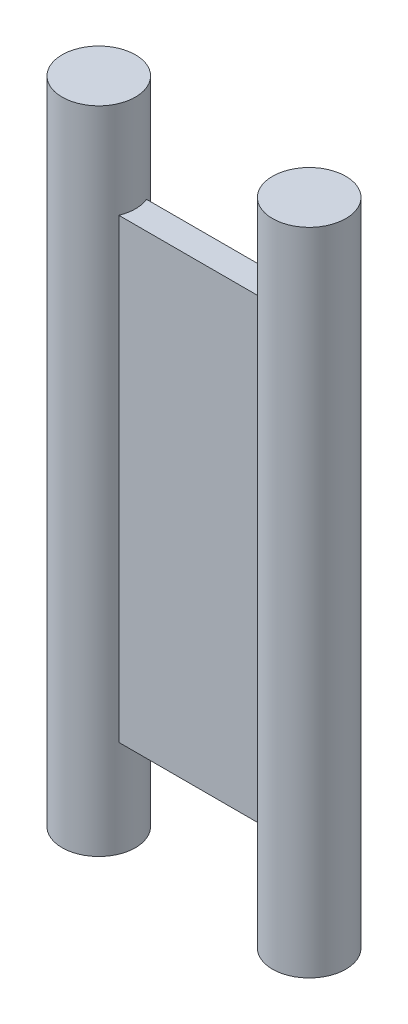
ISO-10303-21;
HEADER;
FILE_DESCRIPTION(('STEP AP214'),'2;1');
FILE_NAME('part.step','',(''),(''),'','','');
FILE_SCHEMA(('AUTOMOTIVE_DESIGN { 1 0 10303 214 1 1 1 1 }'));
ENDSEC;
DATA;
#1=APPLICATION_CONTEXT('core data for automotive mechanical design processes');
#2=APPLICATION_PROTOCOL_DEFINITION('international standard','automotive_design',2000,#1);
#3=PRODUCT_CONTEXT('',#1,'mechanical');
#4=PRODUCT('Part','Part','',(#3));
#5=PRODUCT_RELATED_PRODUCT_CATEGORY('part','',(#4));
#6=PRODUCT_DEFINITION_FORMATION('','',#4);
#7=PRODUCT_DEFINITION_CONTEXT('part definition',#1,'design');
#8=PRODUCT_DEFINITION('design','',#6,#7);
#9=PRODUCT_DEFINITION_SHAPE('','',#8);
#10=(LENGTH_UNIT() NAMED_UNIT(*) SI_UNIT(.MILLI.,.METRE.));
#11=(NAMED_UNIT(*) PLANE_ANGLE_UNIT() SI_UNIT($,.RADIAN.));
#12=(NAMED_UNIT(*) SI_UNIT($,.STERADIAN.) SOLID_ANGLE_UNIT());
#13=UNCERTAINTY_MEASURE_WITH_UNIT(LENGTH_MEASURE(1.E-05),#10,'distance_accuracy_value','');
#14=(GEOMETRIC_REPRESENTATION_CONTEXT(3) GLOBAL_UNCERTAINTY_ASSIGNED_CONTEXT((#13)) GLOBAL_UNIT_ASSIGNED_CONTEXT((#10,
#11,#12)) REPRESENTATION_CONTEXT('',''));
#15=CARTESIAN_POINT('',(0.,0.,0.));
#16=DIRECTION('',(0.,0.,1.));
#17=DIRECTION('',(1.,0.,0.));
#18=AXIS2_PLACEMENT_3D('',#15,#16,#17);
#19=CARTESIAN_POINT('',(3.803,16.5,0.5));
#20=DIRECTION('',(0.,0.,-1.));
#21=DIRECTION('',(-1.,0.,0.));
#22=AXIS2_PLACEMENT_3D('',#19,#20,#21);
#23=PLANE('',#22);
#24=DIRECTION('',(0.,-1.,0.));
#25=VECTOR('',#24,1.);
#26=CARTESIAN_POINT('',(2.5759608808192,20.,0.5));
#27=LINE('',#26,#25);
#28=CARTESIAN_POINT('',(2.5759608808192,16.5,0.5));
#29=VERTEX_POINT('',#28);
#30=CARTESIAN_POINT('',(2.5759608808192,0.,0.499999999999999));
#31=VERTEX_POINT('',#30);
#32=EDGE_CURVE('E53',#29,#31,#27,.T.);
#33=ORIENTED_EDGE('',*,*,#32,.F.);
#34=DIRECTION('',(1.,0.,0.));
#35=VECTOR('',#34,1.);
#36=CARTESIAN_POINT('',(3.803,16.5,0.5));
#37=LINE('',#36,#35);
#38=CARTESIAN_POINT('',(-2.5759608808192,16.5,0.5));
#39=VERTEX_POINT('',#38);
#40=EDGE_CURVE('E90',#39,#29,#37,.T.);
#41=ORIENTED_EDGE('',*,*,#40,.F.);
#42=DIRECTION('',(0.,-1.,0.));
#43=VECTOR('',#42,1.);
#44=CARTESIAN_POINT('',(-2.5759608808192,20.,0.5));
#45=LINE('',#44,#43);
#46=CARTESIAN_POINT('',(-2.5759608808192,0.,0.5));
#47=VERTEX_POINT('',#46);
#48=EDGE_CURVE('E103',#47,#39,#45,.F.);
#49=ORIENTED_EDGE('',*,*,#48,.F.);
#50=DIRECTION('',(1.,0.,0.));
#51=VECTOR('',#50,1.);
#52=CARTESIAN_POINT('',(3.803,0.,0.5));
#53=LINE('',#52,#51);
#54=EDGE_CURVE('E91',#47,#31,#53,.T.);
#55=ORIENTED_EDGE('',*,*,#54,.T.);
#56=EDGE_LOOP('',(#33,#41,#49,#55));
#57=FACE_BOUND('',#56,.T.);
#58=ADVANCED_FACE('F39',(#57),#23,.F.);
#59=CARTESIAN_POINT('',(3.803,16.5,-0.5));
#60=DIRECTION('',(0.,0.,1.));
#61=DIRECTION('',(1.,0.,0.));
#62=AXIS2_PLACEMENT_3D('',#59,#60,#61);
#63=PLANE('',#62);
#64=DIRECTION('',(0.,-1.,0.));
#65=VECTOR('',#64,1.);
#66=CARTESIAN_POINT('',(2.5759608808192,20.,-0.5));
#67=LINE('',#66,#65);
#68=CARTESIAN_POINT('',(2.5759608808192,0.,-0.5));
#69=VERTEX_POINT('',#68);
#70=CARTESIAN_POINT('',(2.5759608808192,16.5,-0.5));
#71=VERTEX_POINT('',#70);
#72=EDGE_CURVE('E78',#69,#71,#67,.F.);
#73=ORIENTED_EDGE('',*,*,#72,.F.);
#74=DIRECTION('',(-1.,0.,0.));
#75=VECTOR('',#74,1.);
#76=CARTESIAN_POINT('',(3.803,0.,-0.5));
#77=LINE('',#76,#75);
#78=CARTESIAN_POINT('',(-2.5759608808192,0.,-0.499999999999999));
#79=VERTEX_POINT('',#78);
#80=EDGE_CURVE('E60',#69,#79,#77,.T.);
#81=ORIENTED_EDGE('',*,*,#80,.T.);
#82=DIRECTION('',(0.,-1.,0.));
#83=VECTOR('',#82,1.);
#84=CARTESIAN_POINT('',(-2.5759608808192,20.,-0.5));
#85=LINE('',#84,#83);
#86=CARTESIAN_POINT('',(-2.5759608808192,16.5,-0.5));
#87=VERTEX_POINT('',#86);
#88=EDGE_CURVE('E105',#87,#79,#85,.T.);
#89=ORIENTED_EDGE('',*,*,#88,.F.);
#90=DIRECTION('',(-1.,0.,0.));
#91=VECTOR('',#90,1.);
#92=CARTESIAN_POINT('',(3.803,16.5,-0.5));
#93=LINE('',#92,#91);
#94=EDGE_CURVE('E85',#71,#87,#93,.T.);
#95=ORIENTED_EDGE('',*,*,#94,.F.);
#96=EDGE_LOOP('',(#73,#81,#89,#95));
#97=FACE_BOUND('',#96,.T.);
#98=ADVANCED_FACE('F84',(#97),#63,.F.);
#99=CARTESIAN_POINT('',(-3.803,20.,0.));
#100=DIRECTION('',(0.,-1.,0.));
#101=DIRECTION('',(0.,0.,-1.));
#102=AXIS2_PLACEMENT_3D('',#99,#100,#101);
#103=CYLINDRICAL_SURFACE('',#102,1.325);
#104=CARTESIAN_POINT('',(-3.803,20.,0.));
#105=DIRECTION('',(0.,1.,0.));
#106=DIRECTION('',(0.,0.,1.));
#107=AXIS2_PLACEMENT_3D('',#104,#105,#106);
#108=CIRCLE('',#107,1.325);
#109=CARTESIAN_POINT('',(-3.803,20.,1.325));
#110=VERTEX_POINT('',#109);
#111=EDGE_CURVE('E107',#110,#110,#108,.T.);
#112=ORIENTED_EDGE('',*,*,#111,.F.);
#113=EDGE_LOOP('',(#112));
#114=FACE_BOUND('',#113,.T.);
#115=CARTESIAN_POINT('',(-3.803,-3.5,0.));
#116=DIRECTION('',(0.,1.,0.));
#117=DIRECTION('',(0.,0.,1.));
#118=AXIS2_PLACEMENT_3D('',#115,#116,#117);
#119=CIRCLE('',#118,1.325);
#120=CARTESIAN_POINT('',(-3.803,-3.5,1.325));
#121=VERTEX_POINT('',#120);
#122=EDGE_CURVE('E108',#121,#121,#119,.T.);
#123=ORIENTED_EDGE('',*,*,#122,.T.);
#124=EDGE_LOOP('',(#123));
#125=FACE_BOUND('',#124,.T.);
#126=ORIENTED_EDGE('',*,*,#48,.T.);
#127=CARTESIAN_POINT('',(-3.803,16.5,0.));
#128=DIRECTION('',(0.,-1.,0.));
#129=DIRECTION('',(0.,0.,-1.));
#130=AXIS2_PLACEMENT_3D('',#127,#128,#129);
#131=CIRCLE('',#130,1.325);
#132=EDGE_CURVE('E95',#39,#87,#131,.F.);
#133=ORIENTED_EDGE('',*,*,#132,.T.);
#134=ORIENTED_EDGE('',*,*,#88,.T.);
#135=CARTESIAN_POINT('',(-3.803,0.,0.));
#136=DIRECTION('',(0.,-1.,0.));
#137=DIRECTION('',(0.,0.,-1.));
#138=AXIS2_PLACEMENT_3D('',#135,#136,#137);
#139=CIRCLE('',#138,1.325);
#140=EDGE_CURVE('E46',#47,#79,#139,.F.);
#141=ORIENTED_EDGE('',*,*,#140,.F.);
#142=EDGE_LOOP('',(#126,#133,#134,#141));
#143=FACE_BOUND('',#142,.T.);
#144=ADVANCED_FACE('F138',(#114,#125,#143),#103,.T.);
#145=CARTESIAN_POINT('',(-3.803,20.,0.));
#146=DIRECTION('',(0.,1.,0.));
#147=DIRECTION('',(0.,0.,1.));
#148=AXIS2_PLACEMENT_3D('',#145,#146,#147);
#149=PLANE('',#148);
#150=ORIENTED_EDGE('',*,*,#111,.T.);
#151=EDGE_LOOP('',(#150));
#152=FACE_BOUND('',#151,.T.);
#153=ADVANCED_FACE('F144',(#152),#149,.T.);
#154=CARTESIAN_POINT('',(-3.803,-3.5,0.));
#155=DIRECTION('',(0.,1.,0.));
#156=DIRECTION('',(0.,0.,1.));
#157=AXIS2_PLACEMENT_3D('',#154,#155,#156);
#158=PLANE('',#157);
#159=ORIENTED_EDGE('',*,*,#122,.F.);
#160=EDGE_LOOP('',(#159));
#161=FACE_BOUND('',#160,.T.);
#162=ADVANCED_FACE('F150',(#161),#158,.F.);
#163=CARTESIAN_POINT('',(0.,16.5,0.));
#164=DIRECTION('',(0.,-1.,0.));
#165=DIRECTION('',(0.,0.,-1.));
#166=AXIS2_PLACEMENT_3D('',#163,#164,#165);
#167=PLANE('',#166);
#168=CARTESIAN_POINT('',(3.803,16.5,0.));
#169=DIRECTION('',(0.,-1.,0.));
#170=DIRECTION('',(0.,0.,-1.));
#171=AXIS2_PLACEMENT_3D('',#168,#169,#170);
#172=CIRCLE('',#171,1.325);
#173=EDGE_CURVE('E111',#71,#29,#172,.F.);
#174=ORIENTED_EDGE('',*,*,#173,.F.);
#175=ORIENTED_EDGE('',*,*,#94,.T.);
#176=ORIENTED_EDGE('',*,*,#132,.F.);
#177=ORIENTED_EDGE('',*,*,#40,.T.);
#178=EDGE_LOOP('',(#174,#175,#176,#177));
#179=FACE_BOUND('',#178,.T.);
#180=ADVANCED_FACE('F141',(#179),#167,.F.);
#181=CARTESIAN_POINT('',(0.,0.,0.));
#182=DIRECTION('',(0.,-1.,0.));
#183=DIRECTION('',(0.,0.,-1.));
#184=AXIS2_PLACEMENT_3D('',#181,#182,#183);
#185=PLANE('',#184);
#186=ORIENTED_EDGE('',*,*,#80,.F.);
#187=CARTESIAN_POINT('',(3.803,0.,0.));
#188=DIRECTION('',(0.,-1.,0.));
#189=DIRECTION('',(0.,0.,-1.));
#190=AXIS2_PLACEMENT_3D('',#187,#188,#189);
#191=CIRCLE('',#190,1.325);
#192=EDGE_CURVE('E11',#69,#31,#191,.F.);
#193=ORIENTED_EDGE('',*,*,#192,.T.);
#194=ORIENTED_EDGE('',*,*,#54,.F.);
#195=ORIENTED_EDGE('',*,*,#140,.T.);
#196=EDGE_LOOP('',(#186,#193,#194,#195));
#197=FACE_BOUND('',#196,.T.);
#198=ADVANCED_FACE('F89',(#197),#185,.T.);
#199=CARTESIAN_POINT('',(3.803,20.,0.));
#200=DIRECTION('',(0.,-1.,0.));
#201=DIRECTION('',(0.,0.,-1.));
#202=AXIS2_PLACEMENT_3D('',#199,#200,#201);
#203=CYLINDRICAL_SURFACE('',#202,1.325);
#204=CARTESIAN_POINT('',(3.803,20.,0.));
#205=DIRECTION('',(0.,1.,0.));
#206=DIRECTION('',(0.,0.,1.));
#207=AXIS2_PLACEMENT_3D('',#204,#205,#206);
#208=CIRCLE('',#207,1.325);
#209=CARTESIAN_POINT('',(3.803,20.,1.325));
#210=VERTEX_POINT('',#209);
#211=EDGE_CURVE('E116',#210,#210,#208,.T.);
#212=ORIENTED_EDGE('',*,*,#211,.F.);
#213=EDGE_LOOP('',(#212));
#214=FACE_BOUND('',#213,.T.);
#215=CARTESIAN_POINT('',(3.803,-3.5,0.));
#216=DIRECTION('',(0.,1.,0.));
#217=DIRECTION('',(0.,0.,1.));
#218=AXIS2_PLACEMENT_3D('',#215,#216,#217);
#219=CIRCLE('',#218,1.325);
#220=CARTESIAN_POINT('',(3.803,-3.5,1.325));
#221=VERTEX_POINT('',#220);
#222=EDGE_CURVE('E86',#221,#221,#219,.T.);
#223=ORIENTED_EDGE('',*,*,#222,.T.);
#224=EDGE_LOOP('',(#223));
#225=FACE_BOUND('',#224,.T.);
#226=ORIENTED_EDGE('',*,*,#72,.T.);
#227=ORIENTED_EDGE('',*,*,#173,.T.);
#228=ORIENTED_EDGE('',*,*,#32,.T.);
#229=ORIENTED_EDGE('',*,*,#192,.F.);
#230=EDGE_LOOP('',(#226,#227,#228,#229));
#231=FACE_BOUND('',#230,.T.);
#232=ADVANCED_FACE('F77',(#214,#225,#231),#203,.T.);
#233=CARTESIAN_POINT('',(3.803,20.,0.));
#234=DIRECTION('',(0.,1.,0.));
#235=DIRECTION('',(0.,0.,1.));
#236=AXIS2_PLACEMENT_3D('',#233,#234,#235);
#237=PLANE('',#236);
#238=ORIENTED_EDGE('',*,*,#211,.T.);
#239=EDGE_LOOP('',(#238));
#240=FACE_BOUND('',#239,.T.);
#241=ADVANCED_FACE('F125',(#240),#237,.T.);
#242=CARTESIAN_POINT('',(3.803,-3.5,0.));
#243=DIRECTION('',(0.,1.,0.));
#244=DIRECTION('',(0.,0.,1.));
#245=AXIS2_PLACEMENT_3D('',#242,#243,#244);
#246=PLANE('',#245);
#247=ORIENTED_EDGE('',*,*,#222,.F.);
#248=EDGE_LOOP('',(#247));
#249=FACE_BOUND('',#248,.T.);
#250=ADVANCED_FACE('F123',(#249),#246,.F.);
#251=CLOSED_SHELL('',(#58,#98,#144,#153,#162,#180,#198,#232,#241,#250));
#252=MANIFOLD_SOLID_BREP('B2',#251);
#253=ADVANCED_BREP_SHAPE_REPRESENTATION('',(#18,#252),#14);
#254=SHAPE_DEFINITION_REPRESENTATION(#9,#253);
ENDSEC;
END-ISO-10303-21;
